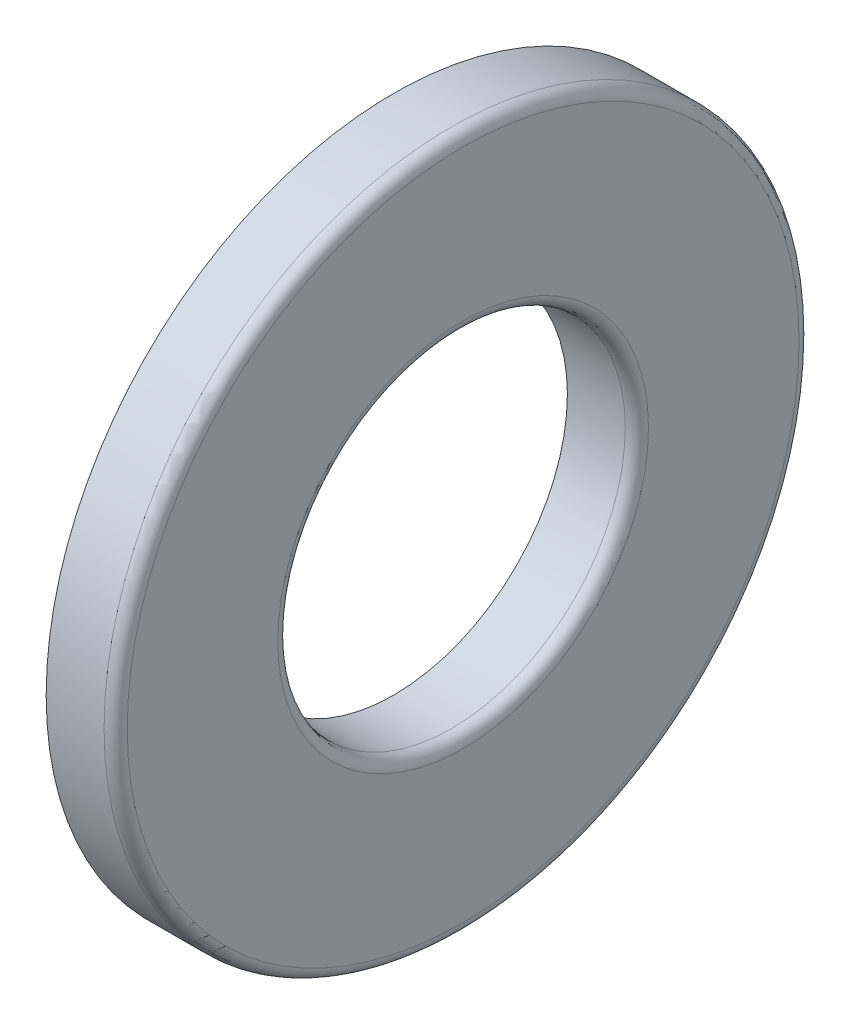
ISO-10303-21;
HEADER;
FILE_DESCRIPTION(('STEP AP214'),'2;1');
FILE_NAME('part.step','',(''),(''),'','','');
FILE_SCHEMA(('AUTOMOTIVE_DESIGN { 1 0 10303 214 1 1 1 1 }'));
ENDSEC;
DATA;
#1=APPLICATION_CONTEXT('core data for automotive mechanical design processes');
#2=APPLICATION_PROTOCOL_DEFINITION('international standard','automotive_design',2000,#1);
#3=PRODUCT_CONTEXT('',#1,'mechanical');
#4=PRODUCT('Part','Part','',(#3));
#5=PRODUCT_RELATED_PRODUCT_CATEGORY('part','',(#4));
#6=PRODUCT_DEFINITION_FORMATION('','',#4);
#7=PRODUCT_DEFINITION_CONTEXT('part definition',#1,'design');
#8=PRODUCT_DEFINITION('design','',#6,#7);
#9=PRODUCT_DEFINITION_SHAPE('','',#8);
#10=(LENGTH_UNIT() NAMED_UNIT(*) SI_UNIT(.MILLI.,.METRE.));
#11=(NAMED_UNIT(*) PLANE_ANGLE_UNIT() SI_UNIT($,.RADIAN.));
#12=(NAMED_UNIT(*) SI_UNIT($,.STERADIAN.) SOLID_ANGLE_UNIT());
#13=UNCERTAINTY_MEASURE_WITH_UNIT(LENGTH_MEASURE(1.E-05),#10,'distance_accuracy_value','');
#14=(GEOMETRIC_REPRESENTATION_CONTEXT(3) GLOBAL_UNCERTAINTY_ASSIGNED_CONTEXT((#13)) GLOBAL_UNIT_ASSIGNED_CONTEXT((#10,
#11,#12)) REPRESENTATION_CONTEXT('',''));
#15=CARTESIAN_POINT('',(0.,0.,0.));
#16=DIRECTION('',(0.,0.,1.));
#17=DIRECTION('',(1.,0.,0.));
#18=AXIS2_PLACEMENT_3D('',#15,#16,#17);
#19=CARTESIAN_POINT('',(10.4999999999989,0.,0.));
#20=DIRECTION('',(1.,0.,0.));
#21=DIRECTION('',(0.,0.,-1.));
#22=AXIS2_PLACEMENT_3D('',#19,#20,#21);
#23=TOROIDAL_SURFACE('',#22,22.5,5.00100000000105);
#24=CARTESIAN_POINT('',(15.,0.,0.));
#25=DIRECTION('',(1.,0.,0.));
#26=DIRECTION('',(0.,0.,-1.));
#27=AXIS2_PLACEMENT_3D('',#24,#25,#26);
#28=CIRCLE('',#27,24.681742652102);
#29=CARTESIAN_POINT('',(15.,0.,-24.681742652102));
#30=VERTEX_POINT('',#29);
#31=EDGE_CURVE('E44',#30,#30,#28,.T.);
#32=ORIENTED_EDGE('',*,*,#31,.F.);
#33=EDGE_LOOP('',(#32));
#34=FACE_BOUND('',#33,.T.);
#35=CARTESIAN_POINT('',(15.,0.,0.));
#36=DIRECTION('',(1.,0.,0.));
#37=DIRECTION('',(0.,0.,-1.));
#38=AXIS2_PLACEMENT_3D('',#35,#36,#37);
#39=CIRCLE('',#38,20.318257347898);
#40=CARTESIAN_POINT('',(15.,0.,-20.318257347898));
#41=VERTEX_POINT('',#40);
#42=EDGE_CURVE('E41',#41,#41,#39,.T.);
#43=ORIENTED_EDGE('',*,*,#42,.T.);
#44=EDGE_LOOP('',(#43));
#45=FACE_BOUND('',#44,.T.);
#46=ADVANCED_FACE('F15',(#34,#45),#23,.F.);
#47=CARTESIAN_POINT('',(15.,30.,0.));
#48=DIRECTION('',(-1.,0.,0.));
#49=DIRECTION('',(0.,0.,1.));
#50=AXIS2_PLACEMENT_3D('',#47,#48,#49);
#51=PLANE('',#50);
#52=ORIENTED_EDGE('',*,*,#31,.T.);
#53=EDGE_LOOP('',(#52));
#54=FACE_BOUND('',#53,.T.);
#55=CARTESIAN_POINT('',(15.,0.,0.));
#56=DIRECTION('',(1.,0.,0.));
#57=DIRECTION('',(0.,0.,-1.));
#58=AXIS2_PLACEMENT_3D('',#55,#56,#57);
#59=CIRCLE('',#58,30.);
#60=CARTESIAN_POINT('',(15.,0.,-30.));
#61=VERTEX_POINT('',#60);
#62=EDGE_CURVE('E38',#61,#61,#59,.T.);
#63=ORIENTED_EDGE('',*,*,#62,.F.);
#64=EDGE_LOOP('',(#63));
#65=FACE_BOUND('',#64,.T.);
#66=ADVANCED_FACE('F48',(#54,#65),#51,.T.);
#67=CARTESIAN_POINT('',(15.,20.318257347898,0.));
#68=DIRECTION('',(-1.,0.,0.));
#69=DIRECTION('',(0.,0.,1.));
#70=AXIS2_PLACEMENT_3D('',#67,#68,#69);
#71=PLANE('',#70);
#72=CARTESIAN_POINT('',(15.,0.,0.));
#73=DIRECTION('',(1.,0.,0.));
#74=DIRECTION('',(0.,0.,-1.));
#75=AXIS2_PLACEMENT_3D('',#72,#73,#74);
#76=CIRCLE('',#75,15.);
#77=CARTESIAN_POINT('',(15.,0.,-15.));
#78=VERTEX_POINT('',#77);
#79=EDGE_CURVE('E35',#78,#78,#76,.T.);
#80=ORIENTED_EDGE('',*,*,#79,.T.);
#81=EDGE_LOOP('',(#80));
#82=FACE_BOUND('',#81,.T.);
#83=ORIENTED_EDGE('',*,*,#42,.F.);
#84=EDGE_LOOP('',(#83));
#85=FACE_BOUND('',#84,.T.);
#86=ADVANCED_FACE('F56',(#82,#85),#71,.T.);
#87=CARTESIAN_POINT('',(21.,0.,0.));
#88=DIRECTION('',(1.,0.,0.));
#89=DIRECTION('',(0.,0.,-1.));
#90=AXIS2_PLACEMENT_3D('',#87,#88,#89);
#91=CYLINDRICAL_SURFACE('',#90,30.);
#92=ORIENTED_EDGE('',*,*,#62,.T.);
#93=EDGE_LOOP('',(#92));
#94=FACE_BOUND('',#93,.T.);
#95=CARTESIAN_POINT('',(20.,0.,0.));
#96=DIRECTION('',(1.,0.,0.));
#97=DIRECTION('',(0.,0.,-1.));
#98=AXIS2_PLACEMENT_3D('',#95,#96,#97);
#99=CIRCLE('',#98,30.);
#100=CARTESIAN_POINT('',(20.,0.,-30.));
#101=VERTEX_POINT('',#100);
#102=EDGE_CURVE('E30',#101,#101,#99,.T.);
#103=ORIENTED_EDGE('',*,*,#102,.F.);
#104=EDGE_LOOP('',(#103));
#105=FACE_BOUND('',#104,.T.);
#106=ADVANCED_FACE('F58',(#94,#105),#91,.T.);
#107=CARTESIAN_POINT('',(21.,0.,0.));
#108=DIRECTION('',(1.,0.,0.));
#109=DIRECTION('',(0.,0.,-1.));
#110=AXIS2_PLACEMENT_3D('',#107,#108,#109);
#111=CYLINDRICAL_SURFACE('',#110,15.);
#112=CARTESIAN_POINT('',(20.,0.,0.));
#113=DIRECTION('',(1.,0.,0.));
#114=DIRECTION('',(0.,0.,-1.));
#115=AXIS2_PLACEMENT_3D('',#112,#113,#114);
#116=CIRCLE('',#115,15.);
#117=CARTESIAN_POINT('',(20.,0.,-15.));
#118=VERTEX_POINT('',#117);
#119=EDGE_CURVE('E26',#118,#118,#116,.T.);
#120=ORIENTED_EDGE('',*,*,#119,.T.);
#121=EDGE_LOOP('',(#120));
#122=FACE_BOUND('',#121,.T.);
#123=ORIENTED_EDGE('',*,*,#79,.F.);
#124=EDGE_LOOP('',(#123));
#125=FACE_BOUND('',#124,.T.);
#126=ADVANCED_FACE('F66',(#122,#125),#111,.F.);
#127=CARTESIAN_POINT('',(20.0000000000016,0.,0.));
#128=DIRECTION('',(1.,0.,0.));
#129=DIRECTION('',(0.,0.,-1.));
#130=AXIS2_PLACEMENT_3D('',#127,#128,#129);
#131=TOROIDAL_SURFACE('',#130,29.0000000000015,0.999999999998457);
#132=ORIENTED_EDGE('',*,*,#102,.T.);
#133=EDGE_LOOP('',(#132));
#134=FACE_BOUND('',#133,.T.);
#135=CARTESIAN_POINT('',(21.,0.,0.));
#136=DIRECTION('',(1.,0.,0.));
#137=DIRECTION('',(0.,0.,-1.));
#138=AXIS2_PLACEMENT_3D('',#135,#136,#137);
#139=CIRCLE('',#138,28.9999998618139);
#140=CARTESIAN_POINT('',(21.,0.,-28.9999998618139));
#141=VERTEX_POINT('',#140);
#142=EDGE_CURVE('E22',#141,#141,#139,.T.);
#143=ORIENTED_EDGE('',*,*,#142,.F.);
#144=EDGE_LOOP('',(#143));
#145=FACE_BOUND('',#144,.T.);
#146=ADVANCED_FACE('F73',(#134,#145),#131,.T.);
#147=CARTESIAN_POINT('',(20.0000000000016,0.,0.));
#148=DIRECTION('',(1.,0.,0.));
#149=DIRECTION('',(0.,0.,-1.));
#150=AXIS2_PLACEMENT_3D('',#147,#148,#149);
#151=TOROIDAL_SURFACE('',#150,15.9999999999984,0.999999999998454);
#152=CARTESIAN_POINT('',(21.,0.,0.));
#153=DIRECTION('',(1.,0.,0.));
#154=DIRECTION('',(0.,0.,-1.));
#155=AXIS2_PLACEMENT_3D('',#152,#153,#154);
#156=CIRCLE('',#155,16.0000001134823);
#157=CARTESIAN_POINT('',(21.,0.,-16.0000001134823));
#158=VERTEX_POINT('',#157);
#159=EDGE_CURVE('E10',#158,#158,#156,.T.);
#160=ORIENTED_EDGE('',*,*,#159,.T.);
#161=EDGE_LOOP('',(#160));
#162=FACE_BOUND('',#161,.T.);
#163=ORIENTED_EDGE('',*,*,#119,.F.);
#164=EDGE_LOOP('',(#163));
#165=FACE_BOUND('',#164,.T.);
#166=ADVANCED_FACE('F76',(#162,#165),#151,.T.);
#167=CARTESIAN_POINT('',(21.,16.,0.));
#168=DIRECTION('',(1.,0.,0.));
#169=DIRECTION('',(0.,0.,-1.));
#170=AXIS2_PLACEMENT_3D('',#167,#168,#169);
#171=PLANE('',#170);
#172=ORIENTED_EDGE('',*,*,#142,.T.);
#173=EDGE_LOOP('',(#172));
#174=FACE_BOUND('',#173,.T.);
#175=ORIENTED_EDGE('',*,*,#159,.F.);
#176=EDGE_LOOP('',(#175));
#177=FACE_BOUND('',#176,.T.);
#178=ADVANCED_FACE('F17',(#174,#177),#171,.T.);
#179=CLOSED_SHELL('',(#46,#66,#86,#106,#126,#146,#166,#178));
#180=MANIFOLD_SOLID_BREP('B1',#179);
#181=ADVANCED_BREP_SHAPE_REPRESENTATION('',(#18,#180),#14);
#182=SHAPE_DEFINITION_REPRESENTATION(#9,#181);
ENDSEC;
END-ISO-10303-21;
